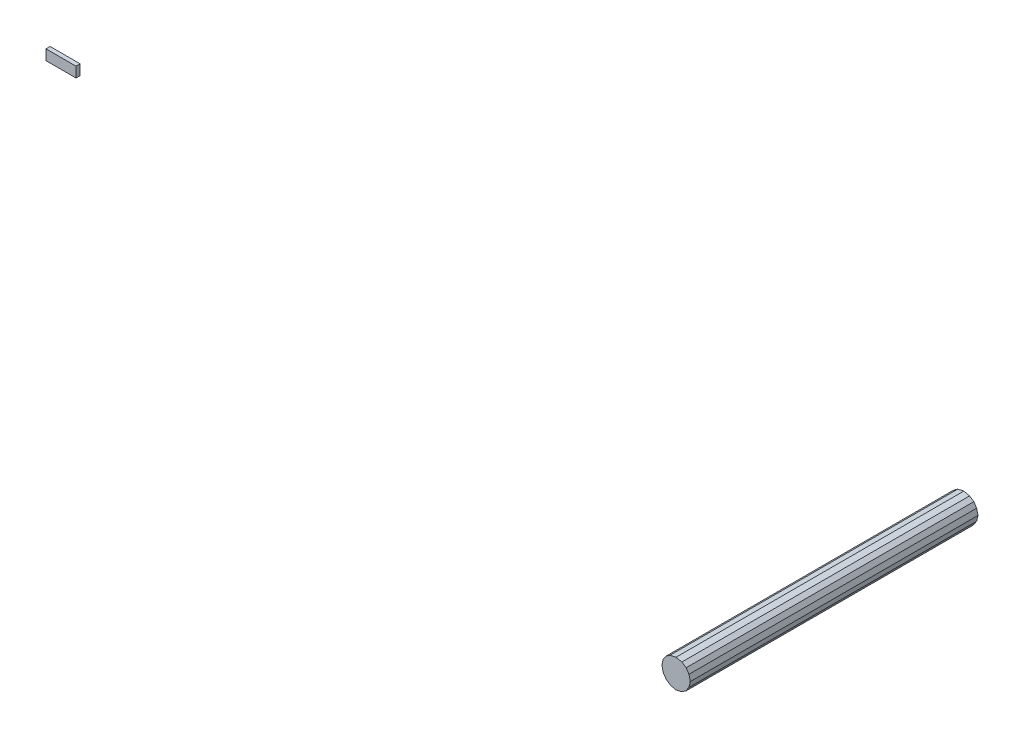
ISO-10303-21;
HEADER;
FILE_DESCRIPTION(('STEP AP214'),'2;1');
FILE_NAME('part.step','',(''),(''),'','','');
FILE_SCHEMA(('AUTOMOTIVE_DESIGN { 1 0 10303 214 1 1 1 1 }'));
ENDSEC;
DATA;
#1=APPLICATION_CONTEXT('core data for automotive mechanical design processes');
#2=APPLICATION_PROTOCOL_DEFINITION('international standard','automotive_design',2000,#1);
#3=PRODUCT_CONTEXT('',#1,'mechanical');
#4=PRODUCT('Part','Part','',(#3));
#5=PRODUCT_RELATED_PRODUCT_CATEGORY('part','',(#4));
#6=PRODUCT_DEFINITION_FORMATION('','',#4);
#7=PRODUCT_DEFINITION_CONTEXT('part definition',#1,'design');
#8=PRODUCT_DEFINITION('design','',#6,#7);
#9=PRODUCT_DEFINITION_SHAPE('','',#8);
#10=(LENGTH_UNIT() NAMED_UNIT(*) SI_UNIT(.MILLI.,.METRE.));
#11=(NAMED_UNIT(*) PLANE_ANGLE_UNIT() SI_UNIT($,.RADIAN.));
#12=(NAMED_UNIT(*) SI_UNIT($,.STERADIAN.) SOLID_ANGLE_UNIT());
#13=UNCERTAINTY_MEASURE_WITH_UNIT(LENGTH_MEASURE(1.E-05),#10,'distance_accuracy_value','');
#14=(GEOMETRIC_REPRESENTATION_CONTEXT(3) GLOBAL_UNCERTAINTY_ASSIGNED_CONTEXT((#13)) GLOBAL_UNIT_ASSIGNED_CONTEXT((#10,
#11,#12)) REPRESENTATION_CONTEXT('',''));
#15=CARTESIAN_POINT('',(0.,0.,0.));
#16=DIRECTION('',(0.,0.,1.));
#17=DIRECTION('',(1.,0.,0.));
#18=AXIS2_PLACEMENT_3D('',#15,#16,#17);
#19=CARTESIAN_POINT('',(37.113689223164,17.909886550342,9.000000650735));
#20=DIRECTION('',(0.,0.,1.));
#21=DIRECTION('',(1.,0.,0.));
#22=AXIS2_PLACEMENT_3D('',#19,#20,#21);
#23=PLANE('',#22);
#24=DIRECTION('',(-0.860789441871855,-0.508961233063914,0.));
#25=VECTOR('',#24,1.);
#26=CARTESIAN_POINT('',(37.294715023164,18.016922150342,9.000000650735));
#27=LINE('',#26,#25);
#28=CARTESIAN_POINT('',(37.294715023164,18.016922150342,9.000000650735));
#29=VERTEX_POINT('',#28);
#30=CARTESIAN_POINT('',(37.113689223164,17.909886550342,9.000000650735));
#31=VERTEX_POINT('',#30);
#32=EDGE_CURVE('P0_E26',#29,#31,#27,.T.);
#33=ORIENTED_EDGE('',*,*,#32,.F.);
#34=DIRECTION('',(-0.539246404118153,-0.842148036657239,0.));
#35=VECTOR('',#34,1.);
#36=CARTESIAN_POINT('',(37.405636823164,18.190150150342,9.000000650735));
#37=LINE('',#36,#35);
#38=CARTESIAN_POINT('',(37.405636823164,18.190150150342,9.000000650735));
#39=VERTEX_POINT('',#38);
#40=EDGE_CURVE('P0_E184',#39,#29,#37,.T.);
#41=ORIENTED_EDGE('',*,*,#40,.F.);
#42=DIRECTION('',(-0.707106781186548,-0.707106781186548,0.));
#43=VECTOR('',#42,1.);
#44=CARTESIAN_POINT('',(37.415390423164,18.199903750342,9.000000650735));
#45=LINE('',#44,#43);
#46=CARTESIAN_POINT('',(37.415390423164,18.199903750342,9.000000650735));
#47=VERTEX_POINT('',#46);
#48=EDGE_CURVE('P0_E186',#47,#39,#45,.T.);
#49=ORIENTED_EDGE('',*,*,#48,.F.);
#50=DIRECTION('',(-0.228497344288947,-0.973544536039774,0.));
#51=VECTOR('',#50,1.);
#52=CARTESIAN_POINT('',(37.467917623164,18.423703150342,9.000000650735));
#53=LINE('',#52,#51);
#54=CARTESIAN_POINT('',(37.467917623164,18.423703150342,9.000000650735));
#55=VERTEX_POINT('',#54);
#56=EDGE_CURVE('P0_E214',#55,#47,#53,.T.);
#57=ORIENTED_EDGE('',*,*,#56,.F.);
#58=DIRECTION('',(0.234264017035985,-0.972173014602938,0.));
#59=VECTOR('',#58,1.);
#60=CARTESIAN_POINT('',(37.415390423164,18.641685950342,9.000000650735));
#61=LINE('',#60,#59);
#62=CARTESIAN_POINT('',(37.415390423164,18.641685950342,9.000000650735));
#63=VERTEX_POINT('',#62);
#64=EDGE_CURVE('P0_E220',#63,#55,#61,.T.);
#65=ORIENTED_EDGE('',*,*,#64,.F.);
#66=DIRECTION('',(0.545689782249991,-0.837987268129986,0.));
#67=VECTOR('',#66,1.);
#68=CARTESIAN_POINT('',(37.306373623164,18.809097350342,9.000000650735));
#69=LINE('',#68,#67);
#70=CARTESIAN_POINT('',(37.306373623164,18.809097350342,9.000000650735));
#71=VERTEX_POINT('',#70);
#72=EDGE_CURVE('P0_E228',#71,#63,#69,.T.);
#73=ORIENTED_EDGE('',*,*,#72,.F.);
#74=DIRECTION('',(0.838007550608019,-0.545658634243012,0.));
#75=VECTOR('',#74,1.);
#76=CARTESIAN_POINT('',(37.138987623164,18.918088750342,9.000000650735));
#77=LINE('',#76,#75);
#78=CARTESIAN_POINT('',(37.138987623164,18.918088750342,9.000000650735));
#79=VERTEX_POINT('',#78);
#80=EDGE_CURVE('P0_E236',#79,#71,#77,.T.);
#81=ORIENTED_EDGE('',*,*,#80,.F.);
#82=DIRECTION('',(0.975388808551702,-0.220491886816932,0.));
#83=VECTOR('',#82,1.);
#84=CARTESIAN_POINT('',(36.915162823164,18.968685550342,9.000000650735));
#85=LINE('',#84,#83);
#86=CARTESIAN_POINT('',(36.915162823164,18.968685550342,9.000000650735));
#87=VERTEX_POINT('',#86);
#88=EDGE_CURVE('P0_E244',#87,#79,#85,.T.);
#89=ORIENTED_EDGE('',*,*,#88,.F.);
#90=DIRECTION('',(0.977328638870001,0.211727966137001,0.));
#91=VECTOR('',#90,1.);
#92=CARTESIAN_POINT('',(36.681609823164,18.918088750342,9.000000650735));
#93=LINE('',#92,#91);
#94=CARTESIAN_POINT('',(36.681609823164,18.918088750342,9.000000650735));
#95=VERTEX_POINT('',#94);
#96=EDGE_CURVE('P0_E252',#95,#87,#93,.T.);
#97=ORIENTED_EDGE('',*,*,#96,.F.);
#98=DIRECTION('',(0.825574759558204,0.564292757689139,0.));
#99=VECTOR('',#98,1.);
#100=CARTESIAN_POINT('',(36.527838223164,18.812983550342,9.000000650735));
#101=LINE('',#100,#99);
#102=CARTESIAN_POINT('',(36.527838223164,18.812983550342,9.000000650735));
#103=VERTEX_POINT('',#102);
#104=EDGE_CURVE('P0_E260',#103,#95,#101,.T.);
#105=ORIENTED_EDGE('',*,*,#104,.F.);
#106=DIRECTION('',(0.57474998902595,0.818329059800928,0.));
#107=VECTOR('',#106,1.);
#108=CARTESIAN_POINT('',(36.413004823164,18.649483750342,9.000000650735));
#109=LINE('',#108,#107);
#110=CARTESIAN_POINT('',(36.413004823164,18.649483750342,9.000000650735));
#111=VERTEX_POINT('',#110);
#112=EDGE_CURVE('P0_E268',#111,#103,#109,.T.);
#113=ORIENTED_EDGE('',*,*,#112,.F.);
#114=DIRECTION('',(0.220491886816932,0.975388808551702,0.));
#115=VECTOR('',#114,1.);
#116=CARTESIAN_POINT('',(36.362408023164,18.425658950342,9.000000650735));
#117=LINE('',#116,#115);
#118=CARTESIAN_POINT('',(36.362408023164,18.425658950342,9.000000650735));
#119=VERTEX_POINT('',#118);
#120=EDGE_CURVE('P0_E276',#119,#111,#117,.T.);
#121=ORIENTED_EDGE('',*,*,#120,.F.);
#122=DIRECTION('',(-0.220491886816932,0.975388808551702,0.));
#123=VECTOR('',#122,1.);
#124=CARTESIAN_POINT('',(36.413004823164,18.201834150342,9.000000650735));
#125=LINE('',#124,#123);
#126=CARTESIAN_POINT('',(36.413004823164,18.201834150342,9.000000650735));
#127=VERTEX_POINT('',#126);
#128=EDGE_CURVE('P0_E284',#127,#119,#125,.T.);
#129=ORIENTED_EDGE('',*,*,#128,.F.);
#130=DIRECTION('',(-0.560904658136019,0.827880404697028,0.));
#131=VECTOR('',#130,1.);
#132=CARTESIAN_POINT('',(36.535636023164,18.020833750342,9.000000650735));
#133=LINE('',#132,#131);
#134=CARTESIAN_POINT('',(36.535636023164,18.020833750342,9.000000650735));
#135=VERTEX_POINT('',#134);
#136=EDGE_CURVE('P0_E292',#135,#127,#133,.T.);
#137=ORIENTED_EDGE('',*,*,#136,.F.);
#138=DIRECTION('',(-0.836425426544044,0.548080747546029,0.));
#139=VECTOR('',#138,1.);
#140=CARTESIAN_POINT('',(36.704952423164,17.909886550342,9.000000650735));
#141=LINE('',#140,#139);
#142=CARTESIAN_POINT('',(36.704952423164,17.909886550342,9.000000650735));
#143=VERTEX_POINT('',#142);
#144=EDGE_CURVE('P0_E300',#143,#135,#141,.T.);
#145=ORIENTED_EDGE('',*,*,#144,.F.);
#146=DIRECTION('',(-0.972798430578044,0.23165321811901,0.));
#147=VECTOR('',#146,1.);
#148=CARTESIAN_POINT('',(36.909320823164,17.861220150342,9.000000650735));
#149=LINE('',#148,#147);
#150=CARTESIAN_POINT('',(36.909320823164,17.861220150342,9.000000650735));
#151=VERTEX_POINT('',#150);
#152=EDGE_CURVE('P0_E65',#151,#143,#149,.T.);
#153=ORIENTED_EDGE('',*,*,#152,.F.);
#154=DIRECTION('',(-0.972798430578044,-0.23165321811901,0.));
#155=VECTOR('',#154,1.);
#156=CARTESIAN_POINT('',(37.113689223164,17.909886550342,9.000000650735));
#157=LINE('',#156,#155);
#158=EDGE_CURVE('P0_E313',#31,#151,#157,.T.);
#159=ORIENTED_EDGE('',*,*,#158,.F.);
#160=EDGE_LOOP('',(#33,#41,#49,#57,#65,#73,#81,#89,#97,#105,#113,#121,#129,#137,#145,#153,#159));
#161=FACE_BOUND('',#160,.T.);
#162=ADVANCED_FACE('P0_F16',(#161),#23,.T.);
#163=CARTESIAN_POINT('',(37.113689223164,17.909886550342,-2.199999809265));
#164=DIRECTION('',(0.,0.,1.));
#165=DIRECTION('',(1.,0.,0.));
#166=AXIS2_PLACEMENT_3D('',#163,#164,#165);
#167=PLANE('',#166);
#168=DIRECTION('',(-0.972798430578044,-0.23165321811901,0.));
#169=VECTOR('',#168,1.);
#170=CARTESIAN_POINT('',(37.113689223164,17.909886550342,-2.199999809265));
#171=LINE('',#170,#169);
#172=CARTESIAN_POINT('',(37.113689223164,17.909886550342,-2.199999809265));
#173=VERTEX_POINT('',#172);
#174=CARTESIAN_POINT('',(36.909320823164,17.861220150342,-2.199999809265));
#175=VERTEX_POINT('',#174);
#176=EDGE_CURVE('P0_E311',#173,#175,#171,.T.);
#177=ORIENTED_EDGE('',*,*,#176,.T.);
#178=DIRECTION('',(-0.972798430578044,0.23165321811901,0.));
#179=VECTOR('',#178,1.);
#180=CARTESIAN_POINT('',(36.909320823164,17.861220150342,-2.199999809265));
#181=LINE('',#180,#179);
#182=CARTESIAN_POINT('',(36.704952423164,17.909886550342,-2.199999809265));
#183=VERTEX_POINT('',#182);
#184=EDGE_CURVE('P0_E305',#175,#183,#181,.T.);
#185=ORIENTED_EDGE('',*,*,#184,.T.);
#186=DIRECTION('',(-0.836425426544044,0.548080747546029,0.));
#187=VECTOR('',#186,1.);
#188=CARTESIAN_POINT('',(36.704952423164,17.909886550342,-2.199999809265));
#189=LINE('',#188,#187);
#190=CARTESIAN_POINT('',(36.535636023164,18.020833750342,-2.199999809265));
#191=VERTEX_POINT('',#190);
#192=EDGE_CURVE('P0_E297',#183,#191,#189,.T.);
#193=ORIENTED_EDGE('',*,*,#192,.T.);
#194=DIRECTION('',(-0.560904658136019,0.827880404697028,0.));
#195=VECTOR('',#194,1.);
#196=CARTESIAN_POINT('',(36.535636023164,18.020833750342,-2.199999809265));
#197=LINE('',#196,#195);
#198=CARTESIAN_POINT('',(36.413004823164,18.201834150342,-2.199999809265));
#199=VERTEX_POINT('',#198);
#200=EDGE_CURVE('P0_E289',#191,#199,#197,.T.);
#201=ORIENTED_EDGE('',*,*,#200,.T.);
#202=DIRECTION('',(-0.220491886816932,0.975388808551702,0.));
#203=VECTOR('',#202,1.);
#204=CARTESIAN_POINT('',(36.413004823164,18.201834150342,-2.199999809265));
#205=LINE('',#204,#203);
#206=CARTESIAN_POINT('',(36.362408023164,18.425658950342,-2.199999809265));
#207=VERTEX_POINT('',#206);
#208=EDGE_CURVE('P0_E281',#199,#207,#205,.T.);
#209=ORIENTED_EDGE('',*,*,#208,.T.);
#210=DIRECTION('',(0.220491886816932,0.975388808551702,0.));
#211=VECTOR('',#210,1.);
#212=CARTESIAN_POINT('',(36.362408023164,18.425658950342,-2.199999809265));
#213=LINE('',#212,#211);
#214=CARTESIAN_POINT('',(36.413004823164,18.649483750342,-2.199999809265));
#215=VERTEX_POINT('',#214);
#216=EDGE_CURVE('P0_E273',#207,#215,#213,.T.);
#217=ORIENTED_EDGE('',*,*,#216,.T.);
#218=DIRECTION('',(0.57474998902595,0.818329059800928,0.));
#219=VECTOR('',#218,1.);
#220=CARTESIAN_POINT('',(36.413004823164,18.649483750342,-2.199999809265));
#221=LINE('',#220,#219);
#222=CARTESIAN_POINT('',(36.527838223164,18.812983550342,-2.199999809265));
#223=VERTEX_POINT('',#222);
#224=EDGE_CURVE('P0_E265',#215,#223,#221,.T.);
#225=ORIENTED_EDGE('',*,*,#224,.T.);
#226=DIRECTION('',(0.825574759558204,0.564292757689139,0.));
#227=VECTOR('',#226,1.);
#228=CARTESIAN_POINT('',(36.527838223164,18.812983550342,-2.199999809265));
#229=LINE('',#228,#227);
#230=CARTESIAN_POINT('',(36.681609823164,18.918088750342,-2.199999809265));
#231=VERTEX_POINT('',#230);
#232=EDGE_CURVE('P0_E257',#223,#231,#229,.T.);
#233=ORIENTED_EDGE('',*,*,#232,.T.);
#234=DIRECTION('',(0.977328638870001,0.211727966137001,0.));
#235=VECTOR('',#234,1.);
#236=CARTESIAN_POINT('',(36.681609823164,18.918088750342,-2.199999809265));
#237=LINE('',#236,#235);
#238=CARTESIAN_POINT('',(36.915162823164,18.968685550342,-2.199999809265));
#239=VERTEX_POINT('',#238);
#240=EDGE_CURVE('P0_E249',#231,#239,#237,.T.);
#241=ORIENTED_EDGE('',*,*,#240,.T.);
#242=DIRECTION('',(0.975388808551702,-0.220491886816932,0.));
#243=VECTOR('',#242,1.);
#244=CARTESIAN_POINT('',(36.915162823164,18.968685550342,-2.199999809265));
#245=LINE('',#244,#243);
#246=CARTESIAN_POINT('',(37.138987623164,18.918088750342,-2.199999809265));
#247=VERTEX_POINT('',#246);
#248=EDGE_CURVE('P0_E241',#239,#247,#245,.T.);
#249=ORIENTED_EDGE('',*,*,#248,.T.);
#250=DIRECTION('',(0.838007550608019,-0.545658634243012,0.));
#251=VECTOR('',#250,1.);
#252=CARTESIAN_POINT('',(37.138987623164,18.918088750342,-2.199999809265));
#253=LINE('',#252,#251);
#254=CARTESIAN_POINT('',(37.306373623164,18.809097350342,-2.199999809265));
#255=VERTEX_POINT('',#254);
#256=EDGE_CURVE('P0_E233',#247,#255,#253,.T.);
#257=ORIENTED_EDGE('',*,*,#256,.T.);
#258=DIRECTION('',(0.545689782249991,-0.837987268129986,0.));
#259=VECTOR('',#258,1.);
#260=CARTESIAN_POINT('',(37.306373623164,18.809097350342,-2.199999809265));
#261=LINE('',#260,#259);
#262=CARTESIAN_POINT('',(37.415390423164,18.641685950342,-2.199999809265));
#263=VERTEX_POINT('',#262);
#264=EDGE_CURVE('P0_E225',#255,#263,#261,.T.);
#265=ORIENTED_EDGE('',*,*,#264,.T.);
#266=DIRECTION('',(0.234264017035985,-0.972173014602938,0.));
#267=VECTOR('',#266,1.);
#268=CARTESIAN_POINT('',(37.415390423164,18.641685950342,-2.199999809265));
#269=LINE('',#268,#267);
#270=CARTESIAN_POINT('',(37.467917623164,18.423703150342,-2.199999809265));
#271=VERTEX_POINT('',#270);
#272=EDGE_CURVE('P0_E217',#263,#271,#269,.T.);
#273=ORIENTED_EDGE('',*,*,#272,.T.);
#274=DIRECTION('',(-0.228497344288947,-0.973544536039774,0.));
#275=VECTOR('',#274,1.);
#276=CARTESIAN_POINT('',(37.467917623164,18.423703150342,-2.199999809265));
#277=LINE('',#276,#275);
#278=CARTESIAN_POINT('',(37.415390423164,18.199903750342,-2.199999809265));
#279=VERTEX_POINT('',#278);
#280=EDGE_CURVE('P0_E203',#271,#279,#277,.T.);
#281=ORIENTED_EDGE('',*,*,#280,.T.);
#282=DIRECTION('',(-0.707106781186548,-0.707106781186548,0.));
#283=VECTOR('',#282,1.);
#284=CARTESIAN_POINT('',(37.415390423164,18.199903750342,-2.199999809265));
#285=LINE('',#284,#283);
#286=CARTESIAN_POINT('',(37.405636823164,18.190150150342,-2.199999809265));
#287=VERTEX_POINT('',#286);
#288=EDGE_CURVE('P0_E190',#279,#287,#285,.T.);
#289=ORIENTED_EDGE('',*,*,#288,.T.);
#290=DIRECTION('',(-0.539246404118153,-0.842148036657239,0.));
#291=VECTOR('',#290,1.);
#292=CARTESIAN_POINT('',(37.405636823164,18.190150150342,-2.199999809265));
#293=LINE('',#292,#291);
#294=CARTESIAN_POINT('',(37.294715023164,18.016922150342,-2.199999809265));
#295=VERTEX_POINT('',#294);
#296=EDGE_CURVE('P0_E179',#287,#295,#293,.T.);
#297=ORIENTED_EDGE('',*,*,#296,.T.);
#298=DIRECTION('',(-0.860789441871855,-0.508961233063914,0.));
#299=VECTOR('',#298,1.);
#300=CARTESIAN_POINT('',(37.294715023164,18.016922150342,-2.199999809265));
#301=LINE('',#300,#299);
#302=EDGE_CURVE('P0_E11',#295,#173,#301,.T.);
#303=ORIENTED_EDGE('',*,*,#302,.T.);
#304=EDGE_LOOP('',(#177,#185,#193,#201,#209,#217,#225,#233,#241,#249,#257,#265,#273,#281,#289,
#297,#303));
#305=FACE_BOUND('',#304,.T.);
#306=ADVANCED_FACE('P0_F501',(#305),#167,.F.);
#307=CARTESIAN_POINT('',(37.294715023164,18.016922150342,-2.199999809265));
#308=DIRECTION('',(0.508961233063914,-0.860789441871855,0.));
#309=DIRECTION('',(-0.860789441871855,-0.508961233063914,0.));
#310=AXIS2_PLACEMENT_3D('',#307,#308,#309);
#311=PLANE('',#310);
#312=DIRECTION('',(0.,0.,1.));
#313=VECTOR('',#312,1.);
#314=CARTESIAN_POINT('',(37.294715023164,18.016922150342,-2.199999809265));
#315=LINE('',#314,#313);
#316=EDGE_CURVE('P0_E189',#295,#29,#315,.T.);
#317=ORIENTED_EDGE('',*,*,#316,.T.);
#318=ORIENTED_EDGE('',*,*,#32,.T.);
#319=DIRECTION('',(0.,0.,1.));
#320=VECTOR('',#319,1.);
#321=CARTESIAN_POINT('',(37.113689223164,17.909886550342,-2.199999809265));
#322=LINE('',#321,#320);
#323=EDGE_CURVE('P0_E317',#173,#31,#322,.T.);
#324=ORIENTED_EDGE('',*,*,#323,.F.);
#325=ORIENTED_EDGE('',*,*,#302,.F.);
#326=EDGE_LOOP('',(#317,#318,#324,#325));
#327=FACE_BOUND('',#326,.T.);
#328=ADVANCED_FACE('P0_F499',(#327),#311,.T.);
#329=CARTESIAN_POINT('',(37.405636823164,18.190150150342,-2.199999809265));
#330=DIRECTION('',(0.842148036657239,-0.539246404118153,0.));
#331=DIRECTION('',(-0.539246404118153,-0.842148036657239,0.));
#332=AXIS2_PLACEMENT_3D('',#329,#330,#331);
#333=PLANE('',#332);
#334=DIRECTION('',(0.,0.,1.));
#335=VECTOR('',#334,1.);
#336=CARTESIAN_POINT('',(37.405636823164,18.190150150342,-2.199999809265));
#337=LINE('',#336,#335);
#338=EDGE_CURVE('P0_E193',#287,#39,#337,.T.);
#339=ORIENTED_EDGE('',*,*,#338,.T.);
#340=ORIENTED_EDGE('',*,*,#40,.T.);
#341=ORIENTED_EDGE('',*,*,#316,.F.);
#342=ORIENTED_EDGE('',*,*,#296,.F.);
#343=EDGE_LOOP('',(#339,#340,#341,#342));
#344=FACE_BOUND('',#343,.T.);
#345=ADVANCED_FACE('P0_F194',(#344),#333,.T.);
#346=CARTESIAN_POINT('',(37.415390423164,18.199903750342,-2.199999809265));
#347=DIRECTION('',(0.707106781186548,-0.707106781186548,0.));
#348=DIRECTION('',(-0.707106781186548,-0.707106781186548,0.));
#349=AXIS2_PLACEMENT_3D('',#346,#347,#348);
#350=PLANE('',#349);
#351=DIRECTION('',(0.,0.,1.));
#352=VECTOR('',#351,1.);
#353=CARTESIAN_POINT('',(37.415390423164,18.199903750342,-2.199999809265));
#354=LINE('',#353,#352);
#355=EDGE_CURVE('P0_E200',#279,#47,#354,.T.);
#356=ORIENTED_EDGE('',*,*,#355,.T.);
#357=ORIENTED_EDGE('',*,*,#48,.T.);
#358=ORIENTED_EDGE('',*,*,#338,.F.);
#359=ORIENTED_EDGE('',*,*,#288,.F.);
#360=EDGE_LOOP('',(#356,#357,#358,#359));
#361=FACE_BOUND('',#360,.T.);
#362=ADVANCED_FACE('P0_F198',(#361),#350,.T.);
#363=CARTESIAN_POINT('',(37.467917623164,18.423703150342,-2.199999809265));
#364=DIRECTION('',(0.973544536039774,-0.228497344288947,0.));
#365=DIRECTION('',(-0.228497344288947,-0.973544536039774,0.));
#366=AXIS2_PLACEMENT_3D('',#363,#364,#365);
#367=PLANE('',#366);
#368=DIRECTION('',(0.,0.,1.));
#369=VECTOR('',#368,1.);
#370=CARTESIAN_POINT('',(37.467917623164,18.423703150342,-2.199999809265));
#371=LINE('',#370,#369);
#372=EDGE_CURVE('P0_E224',#271,#55,#371,.T.);
#373=ORIENTED_EDGE('',*,*,#372,.T.);
#374=ORIENTED_EDGE('',*,*,#56,.T.);
#375=ORIENTED_EDGE('',*,*,#355,.F.);
#376=ORIENTED_EDGE('',*,*,#280,.F.);
#377=EDGE_LOOP('',(#373,#374,#375,#376));
#378=FACE_BOUND('',#377,.T.);
#379=ADVANCED_FACE('P0_F543',(#378),#367,.T.);
#380=CARTESIAN_POINT('',(37.415390423164,18.641685950342,-2.199999809265));
#381=DIRECTION('',(0.972173014602938,0.234264017035985,0.));
#382=DIRECTION('',(0.234264017035985,-0.972173014602938,0.));
#383=AXIS2_PLACEMENT_3D('',#380,#381,#382);
#384=PLANE('',#383);
#385=DIRECTION('',(0.,0.,1.));
#386=VECTOR('',#385,1.);
#387=CARTESIAN_POINT('',(37.415390423164,18.641685950342,-2.199999809265));
#388=LINE('',#387,#386);
#389=EDGE_CURVE('P0_E232',#263,#63,#388,.T.);
#390=ORIENTED_EDGE('',*,*,#389,.T.);
#391=ORIENTED_EDGE('',*,*,#64,.T.);
#392=ORIENTED_EDGE('',*,*,#372,.F.);
#393=ORIENTED_EDGE('',*,*,#272,.F.);
#394=EDGE_LOOP('',(#390,#391,#392,#393));
#395=FACE_BOUND('',#394,.T.);
#396=ADVANCED_FACE('P0_F553',(#395),#384,.T.);
#397=CARTESIAN_POINT('',(37.306373623164,18.809097350342,-2.199999809265));
#398=DIRECTION('',(0.837987268129986,0.545689782249991,0.));
#399=DIRECTION('',(0.545689782249991,-0.837987268129986,0.));
#400=AXIS2_PLACEMENT_3D('',#397,#398,#399);
#401=PLANE('',#400);
#402=DIRECTION('',(0.,0.,1.));
#403=VECTOR('',#402,1.);
#404=CARTESIAN_POINT('',(37.306373623164,18.809097350342,-2.199999809265));
#405=LINE('',#404,#403);
#406=EDGE_CURVE('P0_E240',#255,#71,#405,.T.);
#407=ORIENTED_EDGE('',*,*,#406,.T.);
#408=ORIENTED_EDGE('',*,*,#72,.T.);
#409=ORIENTED_EDGE('',*,*,#389,.F.);
#410=ORIENTED_EDGE('',*,*,#264,.F.);
#411=EDGE_LOOP('',(#407,#408,#409,#410));
#412=FACE_BOUND('',#411,.T.);
#413=ADVANCED_FACE('P0_F564',(#412),#401,.T.);
#414=CARTESIAN_POINT('',(37.138987623164,18.918088750342,-2.199999809265));
#415=DIRECTION('',(0.545658634243012,0.838007550608019,0.));
#416=DIRECTION('',(0.838007550608019,-0.545658634243012,0.));
#417=AXIS2_PLACEMENT_3D('',#414,#415,#416);
#418=PLANE('',#417);
#419=DIRECTION('',(0.,0.,1.));
#420=VECTOR('',#419,1.);
#421=CARTESIAN_POINT('',(37.138987623164,18.918088750342,-2.199999809265));
#422=LINE('',#421,#420);
#423=EDGE_CURVE('P0_E248',#247,#79,#422,.T.);
#424=ORIENTED_EDGE('',*,*,#423,.T.);
#425=ORIENTED_EDGE('',*,*,#80,.T.);
#426=ORIENTED_EDGE('',*,*,#406,.F.);
#427=ORIENTED_EDGE('',*,*,#256,.F.);
#428=EDGE_LOOP('',(#424,#425,#426,#427));
#429=FACE_BOUND('',#428,.T.);
#430=ADVANCED_FACE('P0_F575',(#429),#418,.T.);
#431=CARTESIAN_POINT('',(36.915162823164,18.968685550342,-2.199999809265));
#432=DIRECTION('',(0.220491886816932,0.975388808551702,0.));
#433=DIRECTION('',(0.975388808551702,-0.220491886816932,0.));
#434=AXIS2_PLACEMENT_3D('',#431,#432,#433);
#435=PLANE('',#434);
#436=DIRECTION('',(0.,0.,1.));
#437=VECTOR('',#436,1.);
#438=CARTESIAN_POINT('',(36.915162823164,18.968685550342,-2.199999809265));
#439=LINE('',#438,#437);
#440=EDGE_CURVE('P0_E256',#239,#87,#439,.T.);
#441=ORIENTED_EDGE('',*,*,#440,.T.);
#442=ORIENTED_EDGE('',*,*,#88,.T.);
#443=ORIENTED_EDGE('',*,*,#423,.F.);
#444=ORIENTED_EDGE('',*,*,#248,.F.);
#445=EDGE_LOOP('',(#441,#442,#443,#444));
#446=FACE_BOUND('',#445,.T.);
#447=ADVANCED_FACE('P0_F586',(#446),#435,.T.);
#448=CARTESIAN_POINT('',(36.681609823164,18.918088750342,-2.199999809265));
#449=DIRECTION('',(-0.211727966137001,0.977328638870001,0.));
#450=DIRECTION('',(0.977328638870001,0.211727966137001,0.));
#451=AXIS2_PLACEMENT_3D('',#448,#449,#450);
#452=PLANE('',#451);
#453=DIRECTION('',(0.,0.,1.));
#454=VECTOR('',#453,1.);
#455=CARTESIAN_POINT('',(36.681609823164,18.918088750342,-2.199999809265));
#456=LINE('',#455,#454);
#457=EDGE_CURVE('P0_E264',#231,#95,#456,.T.);
#458=ORIENTED_EDGE('',*,*,#457,.T.);
#459=ORIENTED_EDGE('',*,*,#96,.T.);
#460=ORIENTED_EDGE('',*,*,#440,.F.);
#461=ORIENTED_EDGE('',*,*,#240,.F.);
#462=EDGE_LOOP('',(#458,#459,#460,#461));
#463=FACE_BOUND('',#462,.T.);
#464=ADVANCED_FACE('P0_F597',(#463),#452,.T.);
#465=CARTESIAN_POINT('',(36.527838223164,18.812983550342,-2.199999809265));
#466=DIRECTION('',(-0.564292757689139,0.825574759558204,0.));
#467=DIRECTION('',(0.825574759558204,0.564292757689139,0.));
#468=AXIS2_PLACEMENT_3D('',#465,#466,#467);
#469=PLANE('',#468);
#470=DIRECTION('',(0.,0.,1.));
#471=VECTOR('',#470,1.);
#472=CARTESIAN_POINT('',(36.527838223164,18.812983550342,-2.199999809265));
#473=LINE('',#472,#471);
#474=EDGE_CURVE('P0_E272',#223,#103,#473,.T.);
#475=ORIENTED_EDGE('',*,*,#474,.T.);
#476=ORIENTED_EDGE('',*,*,#104,.T.);
#477=ORIENTED_EDGE('',*,*,#457,.F.);
#478=ORIENTED_EDGE('',*,*,#232,.F.);
#479=EDGE_LOOP('',(#475,#476,#477,#478));
#480=FACE_BOUND('',#479,.T.);
#481=ADVANCED_FACE('P0_F608',(#480),#469,.T.);
#482=CARTESIAN_POINT('',(36.413004823164,18.649483750342,-2.199999809265));
#483=DIRECTION('',(-0.818329059800928,0.57474998902595,0.));
#484=DIRECTION('',(0.57474998902595,0.818329059800928,0.));
#485=AXIS2_PLACEMENT_3D('',#482,#483,#484);
#486=PLANE('',#485);
#487=DIRECTION('',(0.,0.,1.));
#488=VECTOR('',#487,1.);
#489=CARTESIAN_POINT('',(36.413004823164,18.649483750342,-2.199999809265));
#490=LINE('',#489,#488);
#491=EDGE_CURVE('P0_E280',#215,#111,#490,.T.);
#492=ORIENTED_EDGE('',*,*,#491,.T.);
#493=ORIENTED_EDGE('',*,*,#112,.T.);
#494=ORIENTED_EDGE('',*,*,#474,.F.);
#495=ORIENTED_EDGE('',*,*,#224,.F.);
#496=EDGE_LOOP('',(#492,#493,#494,#495));
#497=FACE_BOUND('',#496,.T.);
#498=ADVANCED_FACE('P0_F619',(#497),#486,.T.);
#499=CARTESIAN_POINT('',(36.362408023164,18.425658950342,-2.199999809265));
#500=DIRECTION('',(-0.975388808551702,0.220491886816932,0.));
#501=DIRECTION('',(0.220491886816932,0.975388808551702,0.));
#502=AXIS2_PLACEMENT_3D('',#499,#500,#501);
#503=PLANE('',#502);
#504=DIRECTION('',(0.,0.,1.));
#505=VECTOR('',#504,1.);
#506=CARTESIAN_POINT('',(36.362408023164,18.425658950342,-2.199999809265));
#507=LINE('',#506,#505);
#508=EDGE_CURVE('P0_E288',#207,#119,#507,.T.);
#509=ORIENTED_EDGE('',*,*,#508,.T.);
#510=ORIENTED_EDGE('',*,*,#120,.T.);
#511=ORIENTED_EDGE('',*,*,#491,.F.);
#512=ORIENTED_EDGE('',*,*,#216,.F.);
#513=EDGE_LOOP('',(#509,#510,#511,#512));
#514=FACE_BOUND('',#513,.T.);
#515=ADVANCED_FACE('P0_F630',(#514),#503,.T.);
#516=CARTESIAN_POINT('',(36.413004823164,18.201834150342,-2.199999809265));
#517=DIRECTION('',(-0.975388808551702,-0.220491886816932,0.));
#518=DIRECTION('',(-0.220491886816932,0.975388808551702,0.));
#519=AXIS2_PLACEMENT_3D('',#516,#517,#518);
#520=PLANE('',#519);
#521=DIRECTION('',(0.,0.,1.));
#522=VECTOR('',#521,1.);
#523=CARTESIAN_POINT('',(36.413004823164,18.201834150342,-2.199999809265));
#524=LINE('',#523,#522);
#525=EDGE_CURVE('P0_E296',#199,#127,#524,.T.);
#526=ORIENTED_EDGE('',*,*,#525,.T.);
#527=ORIENTED_EDGE('',*,*,#128,.T.);
#528=ORIENTED_EDGE('',*,*,#508,.F.);
#529=ORIENTED_EDGE('',*,*,#208,.F.);
#530=EDGE_LOOP('',(#526,#527,#528,#529));
#531=FACE_BOUND('',#530,.T.);
#532=ADVANCED_FACE('P0_F641',(#531),#520,.T.);
#533=CARTESIAN_POINT('',(36.535636023164,18.020833750342,-2.199999809265));
#534=DIRECTION('',(-0.827880404697028,-0.560904658136019,0.));
#535=DIRECTION('',(-0.560904658136019,0.827880404697028,0.));
#536=AXIS2_PLACEMENT_3D('',#533,#534,#535);
#537=PLANE('',#536);
#538=DIRECTION('',(0.,0.,1.));
#539=VECTOR('',#538,1.);
#540=CARTESIAN_POINT('',(36.535636023164,18.020833750342,-2.199999809265));
#541=LINE('',#540,#539);
#542=EDGE_CURVE('P0_E304',#191,#135,#541,.T.);
#543=ORIENTED_EDGE('',*,*,#542,.T.);
#544=ORIENTED_EDGE('',*,*,#136,.T.);
#545=ORIENTED_EDGE('',*,*,#525,.F.);
#546=ORIENTED_EDGE('',*,*,#200,.F.);
#547=EDGE_LOOP('',(#543,#544,#545,#546));
#548=FACE_BOUND('',#547,.T.);
#549=ADVANCED_FACE('P0_F652',(#548),#537,.T.);
#550=CARTESIAN_POINT('',(36.704952423164,17.909886550342,-2.199999809265));
#551=DIRECTION('',(-0.548080747546029,-0.836425426544044,0.));
#552=DIRECTION('',(-0.836425426544044,0.548080747546029,0.));
#553=AXIS2_PLACEMENT_3D('',#550,#551,#552);
#554=PLANE('',#553);
#555=DIRECTION('',(0.,0.,1.));
#556=VECTOR('',#555,1.);
#557=CARTESIAN_POINT('',(36.704952423164,17.909886550342,-2.199999809265));
#558=LINE('',#557,#556);
#559=EDGE_CURVE('P0_E310',#183,#143,#558,.T.);
#560=ORIENTED_EDGE('',*,*,#559,.T.);
#561=ORIENTED_EDGE('',*,*,#144,.T.);
#562=ORIENTED_EDGE('',*,*,#542,.F.);
#563=ORIENTED_EDGE('',*,*,#192,.F.);
#564=EDGE_LOOP('',(#560,#561,#562,#563));
#565=FACE_BOUND('',#564,.T.);
#566=ADVANCED_FACE('P0_F494',(#565),#554,.T.);
#567=CARTESIAN_POINT('',(36.909320823164,17.861220150342,-2.199999809265));
#568=DIRECTION('',(-0.23165321811901,-0.972798430578044,0.));
#569=DIRECTION('',(-0.972798430578044,0.23165321811901,0.));
#570=AXIS2_PLACEMENT_3D('',#567,#568,#569);
#571=PLANE('',#570);
#572=DIRECTION('',(0.,0.,1.));
#573=VECTOR('',#572,1.);
#574=CARTESIAN_POINT('',(36.909320823164,17.861220150342,-2.199999809265));
#575=LINE('',#574,#573);
#576=EDGE_CURVE('P0_E316',#175,#151,#575,.T.);
#577=ORIENTED_EDGE('',*,*,#576,.T.);
#578=ORIENTED_EDGE('',*,*,#152,.T.);
#579=ORIENTED_EDGE('',*,*,#559,.F.);
#580=ORIENTED_EDGE('',*,*,#184,.F.);
#581=EDGE_LOOP('',(#577,#578,#579,#580));
#582=FACE_BOUND('',#581,.T.);
#583=ADVANCED_FACE('P0_F497',(#582),#571,.T.);
#584=CARTESIAN_POINT('',(37.113689223164,17.909886550342,-2.199999809265));
#585=DIRECTION('',(0.23165321811901,-0.972798430578044,0.));
#586=DIRECTION('',(-0.972798430578044,-0.23165321811901,0.));
#587=AXIS2_PLACEMENT_3D('',#584,#585,#586);
#588=PLANE('',#587);
#589=ORIENTED_EDGE('',*,*,#323,.T.);
#590=ORIENTED_EDGE('',*,*,#158,.T.);
#591=ORIENTED_EDGE('',*,*,#576,.F.);
#592=ORIENTED_EDGE('',*,*,#176,.F.);
#593=EDGE_LOOP('',(#589,#590,#591,#592));
#594=FACE_BOUND('',#593,.T.);
#595=ADVANCED_FACE('P0_F498',(#594),#588,.T.);
#596=CLOSED_SHELL('',(#162,#306,#328,#345,#362,#379,#396,#413,#430,#447,#464,#481,#498,#515,
#532,#549,#566,#583,#595));
#597=MANIFOLD_SOLID_BREP('P0_B1',#596);
#598=CARTESIAN_POINT('',(3.54798858,17.97438699668,0.15999968));
#599=DIRECTION('',(0.,0.,-1.));
#600=DIRECTION('',(-1.,0.,0.));
#601=AXIS2_PLACEMENT_3D('',#598,#599,#600);
#602=PLANE('',#601);
#603=DIRECTION('',(1.,0.,0.));
#604=VECTOR('',#603,1.);
#605=CARTESIAN_POINT('',(3.54798858,17.97438699668,0.15999968));
#606=LINE('',#605,#604);
#607=CARTESIAN_POINT('',(3.54798858,17.97438699668,0.15999968));
#608=VERTEX_POINT('',#607);
#609=CARTESIAN_POINT('',(4.71638858,17.97438699668,0.15999968));
#610=VERTEX_POINT('',#609);
#611=EDGE_CURVE('P1_E88',#608,#610,#606,.T.);
#612=ORIENTED_EDGE('',*,*,#611,.T.);
#613=DIRECTION('',(0.,1.,0.));
#614=VECTOR('',#613,1.);
#615=CARTESIAN_POINT('',(4.71638858,17.97438699668,0.15999968));
#616=LINE('',#615,#614);
#617=CARTESIAN_POINT('',(4.71638858,18.37438619668,0.15999968));
#618=VERTEX_POINT('',#617);
#619=EDGE_CURVE('P1_E83',#610,#618,#616,.T.);
#620=ORIENTED_EDGE('',*,*,#619,.T.);
#621=DIRECTION('',(-1.,0.,0.));
#622=VECTOR('',#621,1.);
#623=CARTESIAN_POINT('',(4.71638858,18.37438619668,0.15999968));
#624=LINE('',#623,#622);
#625=CARTESIAN_POINT('',(3.54798858,18.37438619668,0.15999968));
#626=VERTEX_POINT('',#625);
#627=EDGE_CURVE('P1_E109',#618,#626,#624,.T.);
#628=ORIENTED_EDGE('',*,*,#627,.T.);
#629=DIRECTION('',(0.,-1.,0.));
#630=VECTOR('',#629,1.);
#631=CARTESIAN_POINT('',(3.54798858,18.37438619668,0.15999968));
#632=LINE('',#631,#630);
#633=EDGE_CURVE('P1_E11',#626,#608,#632,.T.);
#634=ORIENTED_EDGE('',*,*,#633,.T.);
#635=EDGE_LOOP('',(#612,#620,#628,#634));
#636=FACE_BOUND('',#635,.T.);
#637=ADVANCED_FACE('P1_F16',(#636),#602,.F.);
#638=CARTESIAN_POINT('',(3.54798858,17.97438699668,0.));
#639=DIRECTION('',(0.,0.,-1.));
#640=DIRECTION('',(-1.,0.,0.));
#641=AXIS2_PLACEMENT_3D('',#638,#639,#640);
#642=PLANE('',#641);
#643=DIRECTION('',(0.,-1.,0.));
#644=VECTOR('',#643,1.);
#645=CARTESIAN_POINT('',(3.54798858,18.37438619668,0.));
#646=LINE('',#645,#644);
#647=CARTESIAN_POINT('',(3.54798858,18.37438619668,0.));
#648=VERTEX_POINT('',#647);
#649=CARTESIAN_POINT('',(3.54798858,17.97438699668,0.));
#650=VERTEX_POINT('',#649);
#651=EDGE_CURVE('P1_E25',#648,#650,#646,.T.);
#652=ORIENTED_EDGE('',*,*,#651,.F.);
#653=DIRECTION('',(-1.,0.,0.));
#654=VECTOR('',#653,1.);
#655=CARTESIAN_POINT('',(4.71638858,18.37438619668,0.));
#656=LINE('',#655,#654);
#657=CARTESIAN_POINT('',(4.71638858,18.37438619668,0.));
#658=VERTEX_POINT('',#657);
#659=EDGE_CURVE('P1_E71',#658,#648,#656,.T.);
#660=ORIENTED_EDGE('',*,*,#659,.F.);
#661=DIRECTION('',(0.,1.,0.));
#662=VECTOR('',#661,1.);
#663=CARTESIAN_POINT('',(4.71638858,17.97438699668,0.));
#664=LINE('',#663,#662);
#665=CARTESIAN_POINT('',(4.71638858,17.97438699668,0.));
#666=VERTEX_POINT('',#665);
#667=EDGE_CURVE('P1_E65',#666,#658,#664,.T.);
#668=ORIENTED_EDGE('',*,*,#667,.F.);
#669=DIRECTION('',(1.,0.,0.));
#670=VECTOR('',#669,1.);
#671=CARTESIAN_POINT('',(3.54798858,17.97438699668,0.));
#672=LINE('',#671,#670);
#673=EDGE_CURVE('P1_E69',#650,#666,#672,.T.);
#674=ORIENTED_EDGE('',*,*,#673,.F.);
#675=EDGE_LOOP('',(#652,#660,#668,#674));
#676=FACE_BOUND('',#675,.T.);
#677=ADVANCED_FACE('P1_F67',(#676),#642,.T.);
#678=CARTESIAN_POINT('',(3.54798858,18.37438619668,0.));
#679=DIRECTION('',(1.,0.,0.));
#680=DIRECTION('',(0.,-1.,0.));
#681=AXIS2_PLACEMENT_3D('',#678,#679,#680);
#682=PLANE('',#681);
#683=ORIENTED_EDGE('',*,*,#651,.T.);
#684=DIRECTION('',(0.,0.,1.));
#685=VECTOR('',#684,1.);
#686=CARTESIAN_POINT('',(3.54798858,17.97438699668,0.));
#687=LINE('',#686,#685);
#688=EDGE_CURVE('P1_E77',#650,#608,#687,.T.);
#689=ORIENTED_EDGE('',*,*,#688,.T.);
#690=ORIENTED_EDGE('',*,*,#633,.F.);
#691=DIRECTION('',(0.,0.,1.));
#692=VECTOR('',#691,1.);
#693=CARTESIAN_POINT('',(3.54798858,18.37438619668,0.));
#694=LINE('',#693,#692);
#695=EDGE_CURVE('P1_E112',#648,#626,#694,.T.);
#696=ORIENTED_EDGE('',*,*,#695,.F.);
#697=EDGE_LOOP('',(#683,#689,#690,#696));
#698=FACE_BOUND('',#697,.T.);
#699=ADVANCED_FACE('P1_F143',(#698),#682,.F.);
#700=CARTESIAN_POINT('',(4.71638858,18.37438619668,0.));
#701=DIRECTION('',(0.,-1.,0.));
#702=DIRECTION('',(-1.,0.,0.));
#703=AXIS2_PLACEMENT_3D('',#700,#701,#702);
#704=PLANE('',#703);
#705=ORIENTED_EDGE('',*,*,#659,.T.);
#706=ORIENTED_EDGE('',*,*,#695,.T.);
#707=ORIENTED_EDGE('',*,*,#627,.F.);
#708=DIRECTION('',(0.,0.,1.));
#709=VECTOR('',#708,1.);
#710=CARTESIAN_POINT('',(4.71638858,18.37438619668,0.));
#711=LINE('',#710,#709);
#712=EDGE_CURVE('P1_E76',#658,#618,#711,.T.);
#713=ORIENTED_EDGE('',*,*,#712,.F.);
#714=EDGE_LOOP('',(#705,#706,#707,#713));
#715=FACE_BOUND('',#714,.T.);
#716=ADVANCED_FACE('P1_F142',(#715),#704,.F.);
#717=CARTESIAN_POINT('',(4.71638858,17.97438699668,0.));
#718=DIRECTION('',(-1.,0.,0.));
#719=DIRECTION('',(0.,1.,0.));
#720=AXIS2_PLACEMENT_3D('',#717,#718,#719);
#721=PLANE('',#720);
#722=ORIENTED_EDGE('',*,*,#667,.T.);
#723=ORIENTED_EDGE('',*,*,#712,.T.);
#724=ORIENTED_EDGE('',*,*,#619,.F.);
#725=DIRECTION('',(0.,0.,1.));
#726=VECTOR('',#725,1.);
#727=CARTESIAN_POINT('',(4.71638858,17.97438699668,0.));
#728=LINE('',#727,#726);
#729=EDGE_CURVE('P1_E80',#666,#610,#728,.T.);
#730=ORIENTED_EDGE('',*,*,#729,.F.);
#731=EDGE_LOOP('',(#722,#723,#724,#730));
#732=FACE_BOUND('',#731,.T.);
#733=ADVANCED_FACE('P1_F81',(#732),#721,.F.);
#734=CARTESIAN_POINT('',(3.54798858,17.97438699668,0.));
#735=DIRECTION('',(0.,1.,0.));
#736=DIRECTION('',(1.,0.,0.));
#737=AXIS2_PLACEMENT_3D('',#734,#735,#736);
#738=PLANE('',#737);
#739=ORIENTED_EDGE('',*,*,#673,.T.);
#740=ORIENTED_EDGE('',*,*,#729,.T.);
#741=ORIENTED_EDGE('',*,*,#611,.F.);
#742=ORIENTED_EDGE('',*,*,#688,.F.);
#743=EDGE_LOOP('',(#739,#740,#741,#742));
#744=FACE_BOUND('',#743,.T.);
#745=ADVANCED_FACE('P1_F91',(#744),#738,.F.);
#746=CLOSED_SHELL('',(#637,#677,#699,#716,#733,#745));
#747=MANIFOLD_SOLID_BREP('P1_B1',#746);
#748=ADVANCED_BREP_SHAPE_REPRESENTATION('',(#18,#597,#747),#14);
#749=SHAPE_DEFINITION_REPRESENTATION(#9,#748);
ENDSEC;
END-ISO-10303-21;
